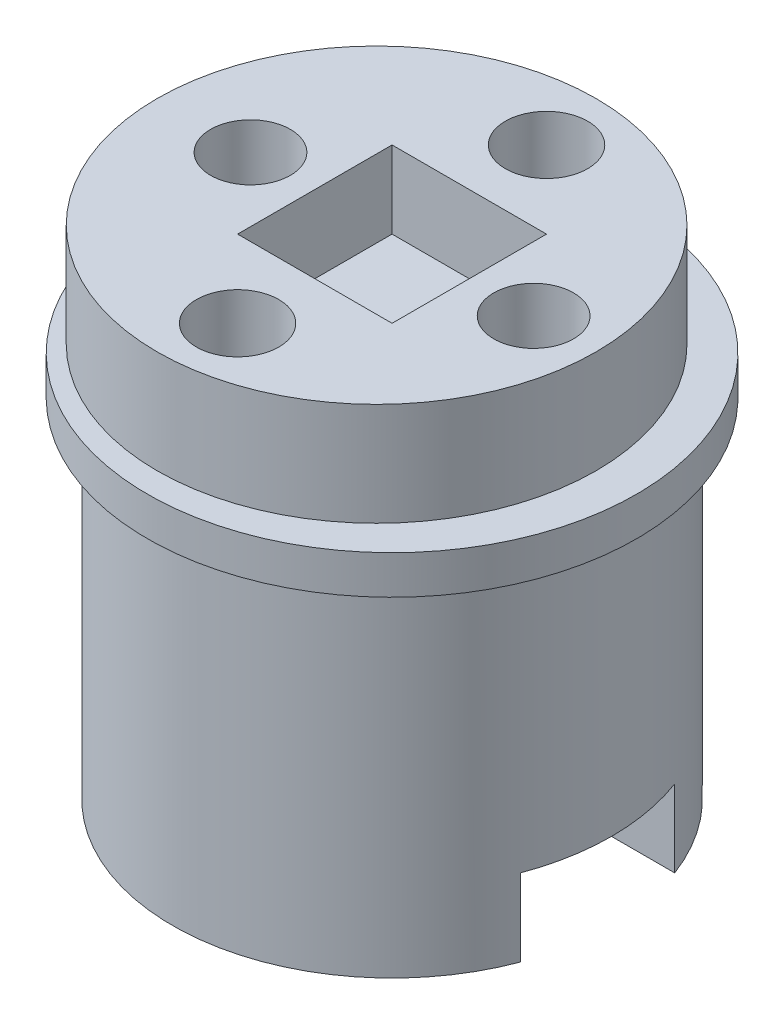
ISO-10303-21;
HEADER;
FILE_DESCRIPTION(('STEP AP214'),'2;1');
FILE_NAME('part.step','',(''),(''),'','','');
FILE_SCHEMA(('AUTOMOTIVE_DESIGN { 1 0 10303 214 1 1 1 1 }'));
ENDSEC;
DATA;
#1=APPLICATION_CONTEXT('core data for automotive mechanical design processes');
#2=APPLICATION_PROTOCOL_DEFINITION('international standard','automotive_design',2000,#1);
#3=PRODUCT_CONTEXT('',#1,'mechanical');
#4=PRODUCT('Part','Part','',(#3));
#5=PRODUCT_RELATED_PRODUCT_CATEGORY('part','',(#4));
#6=PRODUCT_DEFINITION_FORMATION('','',#4);
#7=PRODUCT_DEFINITION_CONTEXT('part definition',#1,'design');
#8=PRODUCT_DEFINITION('design','',#6,#7);
#9=PRODUCT_DEFINITION_SHAPE('','',#8);
#10=(LENGTH_UNIT() NAMED_UNIT(*) SI_UNIT(.MILLI.,.METRE.));
#11=(NAMED_UNIT(*) PLANE_ANGLE_UNIT() SI_UNIT($,.RADIAN.));
#12=(NAMED_UNIT(*) SI_UNIT($,.STERADIAN.) SOLID_ANGLE_UNIT());
#13=UNCERTAINTY_MEASURE_WITH_UNIT(LENGTH_MEASURE(1.E-05),#10,'distance_accuracy_value','');
#14=(GEOMETRIC_REPRESENTATION_CONTEXT(3) GLOBAL_UNCERTAINTY_ASSIGNED_CONTEXT((#13)) GLOBAL_UNIT_ASSIGNED_CONTEXT((#10,
#11,#12)) REPRESENTATION_CONTEXT('',''));
#15=CARTESIAN_POINT('',(0.,0.,0.));
#16=DIRECTION('',(0.,0.,1.));
#17=DIRECTION('',(1.,0.,0.));
#18=AXIS2_PLACEMENT_3D('',#15,#16,#17);
#19=CARTESIAN_POINT('',(6.1,20.6340620433566,0.));
#20=DIRECTION('',(0.,-1.,0.));
#21=DIRECTION('',(0.,0.,-1.));
#22=AXIS2_PLACEMENT_3D('',#19,#20,#21);
#23=CYLINDRICAL_SURFACE('',#22,1.55);
#24=CARTESIAN_POINT('',(6.1,-12.,0.));
#25=DIRECTION('',(0.,-1.,0.));
#26=DIRECTION('',(0.,0.,-1.));
#27=AXIS2_PLACEMENT_3D('',#24,#25,#26);
#28=CIRCLE('',#27,1.55);
#29=CARTESIAN_POINT('',(6.1,-12.,-1.55));
#30=VERTEX_POINT('',#29);
#31=EDGE_CURVE('E196',#30,#30,#28,.F.);
#32=CARTESIAN_POINT('',(6.1,4.,0.));
#33=DIRECTION('',(0.,1.,0.));
#34=DIRECTION('',(0.,0.,1.));
#35=AXIS2_PLACEMENT_3D('',#32,#33,#34);
#36=CIRCLE('',#35,1.55);
#37=CARTESIAN_POINT('',(6.1,4.,-1.55));
#38=VERTEX_POINT('',#37);
#39=EDGE_CURVE('E175',#38,#38,#36,.F.);
#40=CARTESIAN_POINT('',(6.1,-12.,-1.55));
#41=CARTESIAN_POINT('',(6.1,-11.8333333333333,-1.55));
#42=CARTESIAN_POINT('',(6.1,-11.6666666666667,-1.55));
#43=CARTESIAN_POINT('',(6.1,-11.3333333333333,-1.55));
#44=CARTESIAN_POINT('',(6.1,-11.1666666666667,-1.55));
#45=CARTESIAN_POINT('',(6.1,-10.8333333333333,-1.55));
#46=CARTESIAN_POINT('',(6.1,-10.6666666666667,-1.55));
#47=CARTESIAN_POINT('',(6.1,-10.3333333333333,-1.55));
#48=CARTESIAN_POINT('',(6.1,-10.1666666666667,-1.55));
#49=CARTESIAN_POINT('',(6.1,-9.83333333333333,-1.55));
#50=CARTESIAN_POINT('',(6.1,-9.66666666666666,-1.55));
#51=CARTESIAN_POINT('',(6.1,-9.33333333333333,-1.55));
#52=CARTESIAN_POINT('',(6.1,-9.16666666666666,-1.55));
#53=CARTESIAN_POINT('',(6.1,-8.83333333333333,-1.55));
#54=CARTESIAN_POINT('',(6.1,-8.66666666666666,-1.55));
#55=CARTESIAN_POINT('',(6.1,-8.33333333333333,-1.55));
#56=CARTESIAN_POINT('',(6.1,-8.16666666666666,-1.55));
#57=CARTESIAN_POINT('',(6.1,-7.83333333333333,-1.55));
#58=CARTESIAN_POINT('',(6.1,-7.66666666666666,-1.55));
#59=CARTESIAN_POINT('',(6.1,-7.33333333333333,-1.55));
#60=CARTESIAN_POINT('',(6.1,-7.16666666666666,-1.55));
#61=CARTESIAN_POINT('',(6.1,-6.83333333333333,-1.55));
#62=CARTESIAN_POINT('',(6.1,-6.66666666666666,-1.55));
#63=CARTESIAN_POINT('',(6.1,-6.33333333333333,-1.55));
#64=CARTESIAN_POINT('',(6.1,-6.16666666666666,-1.55));
#65=CARTESIAN_POINT('',(6.1,-5.83333333333333,-1.55));
#66=CARTESIAN_POINT('',(6.1,-5.66666666666666,-1.55));
#67=CARTESIAN_POINT('',(6.1,-5.33333333333333,-1.55));
#68=CARTESIAN_POINT('',(6.1,-5.16666666666666,-1.55));
#69=CARTESIAN_POINT('',(6.1,-4.83333333333333,-1.55));
#70=CARTESIAN_POINT('',(6.1,-4.66666666666666,-1.55));
#71=CARTESIAN_POINT('',(6.1,-4.33333333333333,-1.55));
#72=CARTESIAN_POINT('',(6.1,-4.16666666666666,-1.55));
#73=CARTESIAN_POINT('',(6.1,-3.83333333333333,-1.55));
#74=CARTESIAN_POINT('',(6.1,-3.66666666666666,-1.55));
#75=CARTESIAN_POINT('',(6.1,-3.33333333333333,-1.55));
#76=CARTESIAN_POINT('',(6.1,-3.16666666666666,-1.55));
#77=CARTESIAN_POINT('',(6.1,-2.83333333333333,-1.55));
#78=CARTESIAN_POINT('',(6.1,-2.66666666666667,-1.55));
#79=CARTESIAN_POINT('',(6.1,-2.33333333333333,-1.55));
#80=CARTESIAN_POINT('',(6.1,-2.16666666666667,-1.55));
#81=CARTESIAN_POINT('',(6.1,-1.83333333333333,-1.55));
#82=CARTESIAN_POINT('',(6.1,-1.66666666666666,-1.55));
#83=CARTESIAN_POINT('',(6.1,-1.33333333333333,-1.55));
#84=CARTESIAN_POINT('',(6.1,-1.16666666666666,-1.55));
#85=CARTESIAN_POINT('',(6.1,-0.833333333333331,-1.55));
#86=CARTESIAN_POINT('',(6.1,-0.666666666666664,-1.55));
#87=CARTESIAN_POINT('',(6.1,-0.33333333333333,-1.55));
#88=CARTESIAN_POINT('',(6.1,-0.166666666666663,-1.55));
#89=CARTESIAN_POINT('',(6.1,0.16666666666667,-1.55));
#90=CARTESIAN_POINT('',(6.1,0.333333333333337,-1.55));
#91=CARTESIAN_POINT('',(6.1,0.66666666666667,-1.55));
#92=CARTESIAN_POINT('',(6.1,0.833333333333335,-1.55));
#93=CARTESIAN_POINT('',(6.1,1.16666666666667,-1.55));
#94=CARTESIAN_POINT('',(6.1,1.33333333333333,-1.55));
#95=CARTESIAN_POINT('',(6.1,1.66666666666667,-1.55));
#96=CARTESIAN_POINT('',(6.1,1.83333333333334,-1.55));
#97=CARTESIAN_POINT('',(6.1,2.16666666666667,-1.55));
#98=CARTESIAN_POINT('',(6.1,2.33333333333333,-1.55));
#99=CARTESIAN_POINT('',(6.1,2.66666666666667,-1.55));
#100=CARTESIAN_POINT('',(6.1,2.83333333333333,-1.55));
#101=CARTESIAN_POINT('',(6.1,3.16666666666667,-1.55));
#102=CARTESIAN_POINT('',(6.1,3.33333333333333,-1.55));
#103=CARTESIAN_POINT('',(6.1,3.66666666666667,-1.55));
#104=CARTESIAN_POINT('',(6.1,3.83333333333333,-1.55));
#105=CARTESIAN_POINT('',(6.1,4.,-1.55));
#106=B_SPLINE_CURVE_WITH_KNOTS('',3,(#40,#41,#42,#43,#44,#45,#46,#47,#48,#49,#50,#51,#52,#53,
#54,#55,#56,#57,#58,#59,#60,#61,#62,#63,#64,#65,#66,#67,#68,#69,#70,#71,#72,#73,#74,#75,#76,#77,
#78,#79,#80,#81,#82,#83,#84,#85,#86,#87,#88,#89,#90,#91,#92,#93,#94,#95,#96,#97,#98,#99,#100,
#101,#102,#103,#104,#105),.UNSPECIFIED.,.F.,.F.,(4,2,2,2,2,2,2,2,2,2,2,2,2,2,2,2,2,2,2,2,2,2,2,
2,2,2,2,2,2,2,2,2,4),(0.,0.5,1.,1.49999999999999,1.99999999999999,2.5,3.,3.5,3.99999999999999,
4.49999999999999,4.99999999999999,5.49999999999999,5.99999999999999,6.5,7.,7.49999999999999,
7.99999999999999,8.49999999999999,8.99999999999999,9.49999999999999,9.99999999999999,10.5,11.,
11.5,12.,12.5,13.,13.5,14.,14.5,15.,15.5,16.),.UNSPECIFIED.);
#107=EDGE_CURVE('BSEAM38',#30,#38,#106,.T.);
#108=ORIENTED_EDGE('',*,*,#31,.F.);
#109=ORIENTED_EDGE('',*,*,#39,.F.);
#110=ORIENTED_EDGE('',*,*,#107,.T.);
#111=ORIENTED_EDGE('',*,*,#107,.F.);
#112=EDGE_LOOP('',(#108,#110,#109,#111));
#113=FACE_BOUND('',#112,.T.);
#114=ADVANCED_FACE('F38',(#113),#23,.F.);
#115=CARTESIAN_POINT('',(-4.9,20.6340620433566,0.));
#116=DIRECTION('',(0.,-1.,0.));
#117=DIRECTION('',(0.,0.,-1.));
#118=AXIS2_PLACEMENT_3D('',#115,#116,#117);
#119=CYLINDRICAL_SURFACE('',#118,1.55);
#120=CARTESIAN_POINT('',(-4.9,-12.,0.));
#121=DIRECTION('',(0.,-1.,0.));
#122=DIRECTION('',(0.,0.,-1.));
#123=AXIS2_PLACEMENT_3D('',#120,#121,#122);
#124=CIRCLE('',#123,1.55);
#125=CARTESIAN_POINT('',(-4.9,-12.,-1.55));
#126=VERTEX_POINT('',#125);
#127=EDGE_CURVE('E217',#126,#126,#124,.F.);
#128=CARTESIAN_POINT('',(-4.9,4.,0.));
#129=DIRECTION('',(0.,1.,0.));
#130=DIRECTION('',(0.,0.,1.));
#131=AXIS2_PLACEMENT_3D('',#128,#129,#130);
#132=CIRCLE('',#131,1.55);
#133=CARTESIAN_POINT('',(-4.9,4.,-1.55));
#134=VERTEX_POINT('',#133);
#135=EDGE_CURVE('E172',#134,#134,#132,.F.);
#136=CARTESIAN_POINT('',(-4.9,-12.,-1.55));
#137=CARTESIAN_POINT('',(-4.9,-11.8333333333333,-1.55));
#138=CARTESIAN_POINT('',(-4.9,-11.6666666666667,-1.55));
#139=CARTESIAN_POINT('',(-4.9,-11.3333333333333,-1.55));
#140=CARTESIAN_POINT('',(-4.9,-11.1666666666667,-1.55));
#141=CARTESIAN_POINT('',(-4.9,-10.8333333333333,-1.55));
#142=CARTESIAN_POINT('',(-4.9,-10.6666666666667,-1.55));
#143=CARTESIAN_POINT('',(-4.9,-10.3333333333333,-1.55));
#144=CARTESIAN_POINT('',(-4.9,-10.1666666666667,-1.55));
#145=CARTESIAN_POINT('',(-4.9,-9.83333333333333,-1.55));
#146=CARTESIAN_POINT('',(-4.9,-9.66666666666666,-1.55));
#147=CARTESIAN_POINT('',(-4.9,-9.33333333333333,-1.55));
#148=CARTESIAN_POINT('',(-4.9,-9.16666666666666,-1.55));
#149=CARTESIAN_POINT('',(-4.9,-8.83333333333333,-1.55));
#150=CARTESIAN_POINT('',(-4.9,-8.66666666666666,-1.55));
#151=CARTESIAN_POINT('',(-4.9,-8.33333333333333,-1.55));
#152=CARTESIAN_POINT('',(-4.9,-8.16666666666666,-1.55));
#153=CARTESIAN_POINT('',(-4.9,-7.83333333333333,-1.55));
#154=CARTESIAN_POINT('',(-4.9,-7.66666666666666,-1.55));
#155=CARTESIAN_POINT('',(-4.9,-7.33333333333333,-1.55));
#156=CARTESIAN_POINT('',(-4.9,-7.16666666666666,-1.55));
#157=CARTESIAN_POINT('',(-4.9,-6.83333333333333,-1.55));
#158=CARTESIAN_POINT('',(-4.9,-6.66666666666666,-1.55));
#159=CARTESIAN_POINT('',(-4.9,-6.33333333333333,-1.55));
#160=CARTESIAN_POINT('',(-4.9,-6.16666666666666,-1.55));
#161=CARTESIAN_POINT('',(-4.9,-5.83333333333333,-1.55));
#162=CARTESIAN_POINT('',(-4.9,-5.66666666666666,-1.55));
#163=CARTESIAN_POINT('',(-4.9,-5.33333333333333,-1.55));
#164=CARTESIAN_POINT('',(-4.9,-5.16666666666666,-1.55));
#165=CARTESIAN_POINT('',(-4.9,-4.83333333333333,-1.55));
#166=CARTESIAN_POINT('',(-4.9,-4.66666666666666,-1.55));
#167=CARTESIAN_POINT('',(-4.9,-4.33333333333333,-1.55));
#168=CARTESIAN_POINT('',(-4.9,-4.16666666666666,-1.55));
#169=CARTESIAN_POINT('',(-4.9,-3.83333333333333,-1.55));
#170=CARTESIAN_POINT('',(-4.9,-3.66666666666666,-1.55));
#171=CARTESIAN_POINT('',(-4.9,-3.33333333333333,-1.55));
#172=CARTESIAN_POINT('',(-4.9,-3.16666666666666,-1.55));
#173=CARTESIAN_POINT('',(-4.9,-2.83333333333333,-1.55));
#174=CARTESIAN_POINT('',(-4.9,-2.66666666666667,-1.55));
#175=CARTESIAN_POINT('',(-4.9,-2.33333333333333,-1.55));
#176=CARTESIAN_POINT('',(-4.9,-2.16666666666667,-1.55));
#177=CARTESIAN_POINT('',(-4.9,-1.83333333333333,-1.55));
#178=CARTESIAN_POINT('',(-4.9,-1.66666666666666,-1.55));
#179=CARTESIAN_POINT('',(-4.9,-1.33333333333333,-1.55));
#180=CARTESIAN_POINT('',(-4.9,-1.16666666666666,-1.55));
#181=CARTESIAN_POINT('',(-4.9,-0.833333333333331,-1.55));
#182=CARTESIAN_POINT('',(-4.9,-0.666666666666664,-1.55));
#183=CARTESIAN_POINT('',(-4.9,-0.33333333333333,-1.55));
#184=CARTESIAN_POINT('',(-4.9,-0.166666666666663,-1.55));
#185=CARTESIAN_POINT('',(-4.9,0.16666666666667,-1.55));
#186=CARTESIAN_POINT('',(-4.9,0.333333333333337,-1.55));
#187=CARTESIAN_POINT('',(-4.9,0.66666666666667,-1.55));
#188=CARTESIAN_POINT('',(-4.9,0.833333333333335,-1.55));
#189=CARTESIAN_POINT('',(-4.9,1.16666666666667,-1.55));
#190=CARTESIAN_POINT('',(-4.9,1.33333333333333,-1.55));
#191=CARTESIAN_POINT('',(-4.9,1.66666666666667,-1.55));
#192=CARTESIAN_POINT('',(-4.9,1.83333333333334,-1.55));
#193=CARTESIAN_POINT('',(-4.9,2.16666666666667,-1.55));
#194=CARTESIAN_POINT('',(-4.9,2.33333333333333,-1.55));
#195=CARTESIAN_POINT('',(-4.9,2.66666666666667,-1.55));
#196=CARTESIAN_POINT('',(-4.9,2.83333333333333,-1.55));
#197=CARTESIAN_POINT('',(-4.9,3.16666666666667,-1.55));
#198=CARTESIAN_POINT('',(-4.9,3.33333333333333,-1.55));
#199=CARTESIAN_POINT('',(-4.9,3.66666666666667,-1.55));
#200=CARTESIAN_POINT('',(-4.9,3.83333333333333,-1.55));
#201=CARTESIAN_POINT('',(-4.9,4.,-1.55));
#202=B_SPLINE_CURVE_WITH_KNOTS('',3,(#136,#137,#138,#139,#140,#141,#142,#143,#144,#145,#146,
#147,#148,#149,#150,#151,#152,#153,#154,#155,#156,#157,#158,#159,#160,#161,#162,#163,#164,#165,
#166,#167,#168,#169,#170,#171,#172,#173,#174,#175,#176,#177,#178,#179,#180,#181,#182,#183,#184,
#185,#186,#187,#188,#189,#190,#191,#192,#193,#194,#195,#196,#197,#198,#199,#200,#201),
.UNSPECIFIED.,.F.,.F.,(4,2,2,2,2,2,2,2,2,2,2,2,2,2,2,2,2,2,2,2,2,2,2,2,2,2,2,2,2,2,2,2,4),(0.,
0.5,1.,1.49999999999999,1.99999999999999,2.5,3.,3.5,3.99999999999999,4.49999999999999,
4.99999999999999,5.49999999999999,5.99999999999999,6.5,7.,7.49999999999999,7.99999999999999,
8.49999999999999,8.99999999999999,9.49999999999999,9.99999999999999,10.5,11.,11.5,12.,12.5,13.,
13.5,14.,14.5,15.,15.5,16.),.UNSPECIFIED.);
#203=EDGE_CURVE('BSEAM306',#126,#134,#202,.T.);
#204=ORIENTED_EDGE('',*,*,#127,.F.);
#205=ORIENTED_EDGE('',*,*,#135,.F.);
#206=ORIENTED_EDGE('',*,*,#203,.T.);
#207=ORIENTED_EDGE('',*,*,#203,.F.);
#208=EDGE_LOOP('',(#204,#206,#205,#207));
#209=FACE_BOUND('',#208,.T.);
#210=ADVANCED_FACE('F306',(#209),#119,.F.);
#211=CARTESIAN_POINT('',(0.6,20.7754833995939,6.));
#212=DIRECTION('',(0.,-1.,0.));
#213=DIRECTION('',(0.,0.,-1.));
#214=AXIS2_PLACEMENT_3D('',#211,#212,#213);
#215=CYLINDRICAL_SURFACE('',#214,1.6);
#216=CARTESIAN_POINT('',(0.6,-15.,6.));
#217=DIRECTION('',(0.,-1.,0.));
#218=DIRECTION('',(0.,0.,-1.));
#219=AXIS2_PLACEMENT_3D('',#216,#217,#218);
#220=CIRCLE('',#219,1.6);
#221=CARTESIAN_POINT('',(0.6,-15.,4.4));
#222=VERTEX_POINT('',#221);
#223=EDGE_CURVE('E223',#222,#222,#220,.T.);
#224=ORIENTED_EDGE('',*,*,#223,.T.);
#225=EDGE_LOOP('',(#224));
#226=FACE_BOUND('',#225,.T.);
#227=CARTESIAN_POINT('',(0.6,4.,6.));
#228=DIRECTION('',(0.,1.,0.));
#229=DIRECTION('',(0.,0.,1.));
#230=AXIS2_PLACEMENT_3D('',#227,#228,#229);
#231=CIRCLE('',#230,1.6);
#232=CARTESIAN_POINT('',(0.6,4.,7.6));
#233=VERTEX_POINT('',#232);
#234=EDGE_CURVE('E169',#233,#233,#231,.F.);
#235=ORIENTED_EDGE('',*,*,#234,.F.);
#236=EDGE_LOOP('',(#235));
#237=FACE_BOUND('',#236,.T.);
#238=ADVANCED_FACE('F309',(#226,#237),#215,.F.);
#239=CARTESIAN_POINT('',(0.6,20.7754833995939,-6.));
#240=DIRECTION('',(0.,-1.,0.));
#241=DIRECTION('',(0.,0.,-1.));
#242=AXIS2_PLACEMENT_3D('',#239,#240,#241);
#243=CYLINDRICAL_SURFACE('',#242,1.6);
#244=CARTESIAN_POINT('',(0.6,-15.,-6.));
#245=DIRECTION('',(0.,-1.,0.));
#246=DIRECTION('',(0.,0.,1.));
#247=AXIS2_PLACEMENT_3D('',#244,#245,#246);
#248=CIRCLE('',#247,1.6);
#249=CARTESIAN_POINT('',(0.6,-15.,-4.4));
#250=VERTEX_POINT('',#249);
#251=EDGE_CURVE('E220',#250,#250,#248,.T.);
#252=ORIENTED_EDGE('',*,*,#251,.T.);
#253=EDGE_LOOP('',(#252));
#254=FACE_BOUND('',#253,.T.);
#255=CARTESIAN_POINT('',(0.6,4.,-6.));
#256=DIRECTION('',(0.,1.,0.));
#257=DIRECTION('',(0.,0.,1.));
#258=AXIS2_PLACEMENT_3D('',#255,#256,#257);
#259=CIRCLE('',#258,1.6);
#260=CARTESIAN_POINT('',(0.6,4.,-4.4));
#261=VERTEX_POINT('',#260);
#262=EDGE_CURVE('E163',#261,#261,#259,.F.);
#263=ORIENTED_EDGE('',*,*,#262,.F.);
#264=EDGE_LOOP('',(#263));
#265=FACE_BOUND('',#264,.T.);
#266=ADVANCED_FACE('F329',(#254,#265),#243,.F.);
#267=CARTESIAN_POINT('',(0.,4.,0.));
#268=DIRECTION('',(0.,-1.,0.));
#269=DIRECTION('',(0.,0.,-1.));
#270=AXIS2_PLACEMENT_3D('',#267,#268,#269);
#271=CYLINDRICAL_SURFACE('',#270,8.525);
#272=CARTESIAN_POINT('',(0.,4.,0.));
#273=DIRECTION('',(0.,1.,0.));
#274=DIRECTION('',(0.,0.,1.));
#275=AXIS2_PLACEMENT_3D('',#272,#273,#274);
#276=CIRCLE('',#275,8.525);
#277=CARTESIAN_POINT('',(0.,4.,8.525));
#278=VERTEX_POINT('',#277);
#279=EDGE_CURVE('E243',#278,#278,#276,.T.);
#280=ORIENTED_EDGE('',*,*,#279,.F.);
#281=EDGE_LOOP('',(#280));
#282=FACE_BOUND('',#281,.T.);
#283=CARTESIAN_POINT('',(0.,0.,0.));
#284=DIRECTION('',(0.,1.,0.));
#285=DIRECTION('',(0.,0.,1.));
#286=AXIS2_PLACEMENT_3D('',#283,#284,#285);
#287=CIRCLE('',#286,8.525);
#288=CARTESIAN_POINT('',(0.,0.,8.525));
#289=VERTEX_POINT('',#288);
#290=EDGE_CURVE('E247',#289,#289,#287,.T.);
#291=ORIENTED_EDGE('',*,*,#290,.T.);
#292=EDGE_LOOP('',(#291));
#293=FACE_BOUND('',#292,.T.);
#294=ADVANCED_FACE('F40',(#282,#293),#271,.T.);
#295=CARTESIAN_POINT('',(0.,4.,0.));
#296=DIRECTION('',(0.,1.,0.));
#297=DIRECTION('',(0.,0.,1.));
#298=AXIS2_PLACEMENT_3D('',#295,#296,#297);
#299=PLANE('',#298);
#300=DIRECTION('',(0.,0.,-1.));
#301=VECTOR('',#300,1.);
#302=CARTESIAN_POINT('',(3.6,4.,-3.));
#303=LINE('',#302,#301);
#304=CARTESIAN_POINT('',(3.6,4.,3.));
#305=VERTEX_POINT('',#304);
#306=CARTESIAN_POINT('',(3.6,4.,-3.));
#307=VERTEX_POINT('',#306);
#308=EDGE_CURVE('E53',#305,#307,#303,.T.);
#309=ORIENTED_EDGE('',*,*,#308,.F.);
#310=DIRECTION('',(1.,0.,0.));
#311=VECTOR('',#310,1.);
#312=CARTESIAN_POINT('',(3.6,4.,3.));
#313=LINE('',#312,#311);
#314=CARTESIAN_POINT('',(-2.4,4.,3.));
#315=VERTEX_POINT('',#314);
#316=EDGE_CURVE('E148',#315,#305,#313,.T.);
#317=ORIENTED_EDGE('',*,*,#316,.F.);
#318=DIRECTION('',(0.,0.,1.));
#319=VECTOR('',#318,1.);
#320=CARTESIAN_POINT('',(-2.4,4.,-3.));
#321=LINE('',#320,#319);
#322=CARTESIAN_POINT('',(-2.4,4.,-3.));
#323=VERTEX_POINT('',#322);
#324=EDGE_CURVE('E151',#323,#315,#321,.T.);
#325=ORIENTED_EDGE('',*,*,#324,.F.);
#326=DIRECTION('',(-1.,0.,0.));
#327=VECTOR('',#326,1.);
#328=CARTESIAN_POINT('',(3.6,4.,-3.));
#329=LINE('',#328,#327);
#330=EDGE_CURVE('E157',#307,#323,#329,.T.);
#331=ORIENTED_EDGE('',*,*,#330,.F.);
#332=EDGE_LOOP('',(#309,#317,#325,#331));
#333=FACE_BOUND('',#332,.T.);
#334=ORIENTED_EDGE('',*,*,#279,.T.);
#335=EDGE_LOOP('',(#334));
#336=FACE_BOUND('',#335,.T.);
#337=ORIENTED_EDGE('',*,*,#262,.T.);
#338=EDGE_LOOP('',(#337));
#339=FACE_BOUND('',#338,.T.);
#340=ORIENTED_EDGE('',*,*,#234,.T.);
#341=EDGE_LOOP('',(#340));
#342=FACE_BOUND('',#341,.T.);
#343=ORIENTED_EDGE('',*,*,#135,.T.);
#344=EDGE_LOOP('',(#343));
#345=FACE_BOUND('',#344,.T.);
#346=ORIENTED_EDGE('',*,*,#39,.T.);
#347=EDGE_LOOP('',(#346));
#348=FACE_BOUND('',#347,.T.);
#349=ADVANCED_FACE('F313',(#333,#336,#339,#342,#345,#348),#299,.T.);
#350=CARTESIAN_POINT('',(0.6,0.,0.));
#351=DIRECTION('',(0.,-1.,0.));
#352=DIRECTION('',(0.,0.,-1.));
#353=AXIS2_PLACEMENT_3D('',#350,#351,#352);
#354=PLANE('',#353);
#355=ORIENTED_EDGE('',*,*,#290,.F.);
#356=EDGE_LOOP('',(#355));
#357=FACE_BOUND('',#356,.T.);
#358=CARTESIAN_POINT('',(0.6,0.,0.));
#359=DIRECTION('',(0.,-1.,0.));
#360=DIRECTION('',(0.,0.,-1.));
#361=AXIS2_PLACEMENT_3D('',#358,#359,#360);
#362=CIRCLE('',#361,9.5);
#363=CARTESIAN_POINT('',(0.6,0.,-9.5));
#364=VERTEX_POINT('',#363);
#365=EDGE_CURVE('E226',#364,#364,#362,.T.);
#366=ORIENTED_EDGE('',*,*,#365,.F.);
#367=EDGE_LOOP('',(#366));
#368=FACE_BOUND('',#367,.T.);
#369=ADVANCED_FACE('F316',(#357,#368),#354,.F.);
#370=CARTESIAN_POINT('',(0.6,-1.5,0.));
#371=DIRECTION('',(0.,1.,0.));
#372=DIRECTION('',(0.,0.,1.));
#373=AXIS2_PLACEMENT_3D('',#370,#371,#372);
#374=CYLINDRICAL_SURFACE('',#373,9.5);
#375=CARTESIAN_POINT('',(0.6,-1.5,0.));
#376=DIRECTION('',(0.,-1.,0.));
#377=DIRECTION('',(0.,0.,-1.));
#378=AXIS2_PLACEMENT_3D('',#375,#376,#377);
#379=CIRCLE('',#378,9.5);
#380=CARTESIAN_POINT('',(0.6,-1.5,-9.5));
#381=VERTEX_POINT('',#380);
#382=EDGE_CURVE('E227',#381,#381,#379,.T.);
#383=ORIENTED_EDGE('',*,*,#382,.F.);
#384=EDGE_LOOP('',(#383));
#385=FACE_BOUND('',#384,.T.);
#386=ORIENTED_EDGE('',*,*,#365,.T.);
#387=EDGE_LOOP('',(#386));
#388=FACE_BOUND('',#387,.T.);
#389=ADVANCED_FACE('F340',(#385,#388),#374,.T.);
#390=CARTESIAN_POINT('',(0.6,-1.5,0.));
#391=DIRECTION('',(0.,-1.,0.));
#392=DIRECTION('',(0.,0.,-1.));
#393=AXIS2_PLACEMENT_3D('',#390,#391,#392);
#394=PLANE('',#393);
#395=CARTESIAN_POINT('',(0.6,-1.5,0.));
#396=DIRECTION('',(0.,-1.,0.));
#397=DIRECTION('',(0.,0.,-1.));
#398=AXIS2_PLACEMENT_3D('',#395,#396,#397);
#399=CIRCLE('',#398,8.525);
#400=CARTESIAN_POINT('',(0.6,-1.5,-8.525));
#401=VERTEX_POINT('',#400);
#402=EDGE_CURVE('E230',#401,#401,#399,.T.);
#403=ORIENTED_EDGE('',*,*,#402,.F.);
#404=EDGE_LOOP('',(#403));
#405=FACE_BOUND('',#404,.T.);
#406=ORIENTED_EDGE('',*,*,#382,.T.);
#407=EDGE_LOOP('',(#406));
#408=FACE_BOUND('',#407,.T.);
#409=ADVANCED_FACE('F336',(#405,#408),#394,.T.);
#410=CARTESIAN_POINT('',(0.6,-9.2,0.));
#411=DIRECTION('',(0.,-1.,0.));
#412=DIRECTION('',(0.,0.,-1.));
#413=AXIS2_PLACEMENT_3D('',#410,#411,#412);
#414=PLANE('',#413);
#415=CARTESIAN_POINT('',(0.6,-9.2,0.));
#416=DIRECTION('',(0.,-1.,0.));
#417=DIRECTION('',(0.,0.,-1.));
#418=AXIS2_PLACEMENT_3D('',#415,#416,#417);
#419=CIRCLE('',#418,2.1);
#420=CARTESIAN_POINT('',(0.6,-9.2,-2.1));
#421=VERTEX_POINT('',#420);
#422=EDGE_CURVE('E233',#421,#421,#419,.T.);
#423=ORIENTED_EDGE('',*,*,#422,.T.);
#424=EDGE_LOOP('',(#423));
#425=FACE_BOUND('',#424,.T.);
#426=ADVANCED_FACE('F339',(#425),#414,.T.);
#427=CARTESIAN_POINT('',(0.6,-9.2,0.));
#428=DIRECTION('',(0.,-1.,0.));
#429=DIRECTION('',(0.,0.,-1.));
#430=AXIS2_PLACEMENT_3D('',#427,#428,#429);
#431=CYLINDRICAL_SURFACE('',#430,2.1);
#432=ORIENTED_EDGE('',*,*,#422,.F.);
#433=EDGE_LOOP('',(#432));
#434=FACE_BOUND('',#433,.T.);
#435=CARTESIAN_POINT('',(0.6,-15.,0.));
#436=DIRECTION('',(0.,-1.,0.));
#437=DIRECTION('',(0.,0.,-1.));
#438=AXIS2_PLACEMENT_3D('',#435,#436,#437);
#439=CIRCLE('',#438,2.1);
#440=CARTESIAN_POINT('',(0.6,-15.,-2.1));
#441=VERTEX_POINT('',#440);
#442=EDGE_CURVE('E237',#441,#441,#439,.T.);
#443=ORIENTED_EDGE('',*,*,#442,.T.);
#444=EDGE_LOOP('',(#443));
#445=FACE_BOUND('',#444,.T.);
#446=ADVANCED_FACE('F347',(#434,#445),#431,.F.);
#447=CARTESIAN_POINT('',(0.6,-15.,0.));
#448=DIRECTION('',(0.,-1.,0.));
#449=DIRECTION('',(0.,0.,-1.));
#450=AXIS2_PLACEMENT_3D('',#447,#448,#449);
#451=PLANE('',#450);
#452=DIRECTION('',(1.,0.,0.));
#453=VECTOR('',#452,1.);
#454=CARTESIAN_POINT('',(-4.9,-15.,-3.));
#455=LINE('',#454,#453);
#456=CARTESIAN_POINT('',(-7.37970080892761,-15.,-3.));
#457=VERTEX_POINT('',#456);
#458=CARTESIAN_POINT('',(-4.9,-15.,-3.));
#459=VERTEX_POINT('',#458);
#460=EDGE_CURVE('E181',#457,#459,#455,.T.);
#461=ORIENTED_EDGE('',*,*,#460,.F.);
#462=CARTESIAN_POINT('',(0.6,-15.,0.));
#463=DIRECTION('',(0.,-1.,0.));
#464=DIRECTION('',(0.,0.,-1.));
#465=AXIS2_PLACEMENT_3D('',#462,#463,#464);
#466=CIRCLE('',#465,8.525);
#467=CARTESIAN_POINT('',(8.57970080892761,-15.,-3.));
#468=VERTEX_POINT('',#467);
#469=EDGE_CURVE('E236',#457,#468,#466,.T.);
#470=ORIENTED_EDGE('',*,*,#469,.T.);
#471=DIRECTION('',(1.,0.,0.));
#472=VECTOR('',#471,1.);
#473=CARTESIAN_POINT('',(6.1,-15.,-3.));
#474=LINE('',#473,#472);
#475=CARTESIAN_POINT('',(6.1,-15.,-3.));
#476=VERTEX_POINT('',#475);
#477=EDGE_CURVE('E205',#476,#468,#474,.T.);
#478=ORIENTED_EDGE('',*,*,#477,.F.);
#479=CARTESIAN_POINT('',(6.1,-15.,0.));
#480=DIRECTION('',(0.,-1.,0.));
#481=DIRECTION('',(0.,0.,-1.));
#482=AXIS2_PLACEMENT_3D('',#479,#480,#481);
#483=CIRCLE('',#482,3.);
#484=CARTESIAN_POINT('',(6.1,-15.,3.));
#485=VERTEX_POINT('',#484);
#486=EDGE_CURVE('E190',#485,#476,#483,.T.);
#487=ORIENTED_EDGE('',*,*,#486,.F.);
#488=DIRECTION('',(-1.,0.,0.));
#489=VECTOR('',#488,1.);
#490=CARTESIAN_POINT('',(6.1,-15.,3.));
#491=LINE('',#490,#489);
#492=CARTESIAN_POINT('',(8.57970080892761,-15.,3.));
#493=VERTEX_POINT('',#492);
#494=EDGE_CURVE('E203',#493,#485,#491,.T.);
#495=ORIENTED_EDGE('',*,*,#494,.F.);
#496=CARTESIAN_POINT('',(-7.37970080892761,-15.,3.));
#497=VERTEX_POINT('',#496);
#498=EDGE_CURVE('E242',#493,#497,#466,.T.);
#499=ORIENTED_EDGE('',*,*,#498,.T.);
#500=DIRECTION('',(-1.,0.,0.));
#501=VECTOR('',#500,1.);
#502=CARTESIAN_POINT('',(-4.9,-15.,3.));
#503=LINE('',#502,#501);
#504=CARTESIAN_POINT('',(-4.9,-15.,3.));
#505=VERTEX_POINT('',#504);
#506=EDGE_CURVE('E189',#505,#497,#503,.T.);
#507=ORIENTED_EDGE('',*,*,#506,.F.);
#508=CARTESIAN_POINT('',(-4.9,-15.,0.));
#509=DIRECTION('',(0.,-1.,0.));
#510=DIRECTION('',(0.,0.,-1.));
#511=AXIS2_PLACEMENT_3D('',#508,#509,#510);
#512=CIRCLE('',#511,3.);
#513=EDGE_CURVE('E186',#459,#505,#512,.T.);
#514=ORIENTED_EDGE('',*,*,#513,.F.);
#515=EDGE_LOOP('',(#461,#470,#478,#487,#495,#499,#507,#514));
#516=FACE_BOUND('',#515,.T.);
#517=ORIENTED_EDGE('',*,*,#251,.F.);
#518=EDGE_LOOP('',(#517));
#519=FACE_BOUND('',#518,.T.);
#520=ORIENTED_EDGE('',*,*,#223,.F.);
#521=EDGE_LOOP('',(#520));
#522=FACE_BOUND('',#521,.T.);
#523=ORIENTED_EDGE('',*,*,#442,.F.);
#524=EDGE_LOOP('',(#523));
#525=FACE_BOUND('',#524,.T.);
#526=ADVANCED_FACE('F273',(#516,#519,#522,#525),#451,.T.);
#527=CARTESIAN_POINT('',(0.6,-15.,0.));
#528=DIRECTION('',(0.,1.,0.));
#529=DIRECTION('',(0.,0.,1.));
#530=AXIS2_PLACEMENT_3D('',#527,#528,#529);
#531=CYLINDRICAL_SURFACE('',#530,8.525);
#532=ORIENTED_EDGE('',*,*,#469,.F.);
#533=DIRECTION('',(0.,1.,0.));
#534=VECTOR('',#533,1.);
#535=CARTESIAN_POINT('',(-7.37970080892761,-15.,-3.));
#536=LINE('',#535,#534);
#537=CARTESIAN_POINT('',(-7.37970080892761,-12.,-3.));
#538=VERTEX_POINT('',#537);
#539=EDGE_CURVE('E11',#457,#538,#536,.T.);
#540=ORIENTED_EDGE('',*,*,#539,.T.);
#541=CARTESIAN_POINT('',(0.6,-12.,0.));
#542=DIRECTION('',(0.,-1.,0.));
#543=DIRECTION('',(0.,0.,-1.));
#544=AXIS2_PLACEMENT_3D('',#541,#542,#543);
#545=CIRCLE('',#544,8.525);
#546=CARTESIAN_POINT('',(-7.37970080892761,-12.,3.));
#547=VERTEX_POINT('',#546);
#548=EDGE_CURVE('E259',#547,#538,#545,.T.);
#549=ORIENTED_EDGE('',*,*,#548,.F.);
#550=DIRECTION('',(0.,1.,0.));
#551=VECTOR('',#550,1.);
#552=CARTESIAN_POINT('',(-7.37970080892761,-15.,3.));
#553=LINE('',#552,#551);
#554=EDGE_CURVE('E46',#547,#497,#553,.F.);
#555=ORIENTED_EDGE('',*,*,#554,.T.);
#556=ORIENTED_EDGE('',*,*,#498,.F.);
#557=DIRECTION('',(0.,1.,0.));
#558=VECTOR('',#557,1.);
#559=CARTESIAN_POINT('',(8.57970080892761,-15.,3.));
#560=LINE('',#559,#558);
#561=CARTESIAN_POINT('',(8.57970080892761,-12.,3.));
#562=VERTEX_POINT('',#561);
#563=EDGE_CURVE('E256',#493,#562,#560,.T.);
#564=ORIENTED_EDGE('',*,*,#563,.T.);
#565=CARTESIAN_POINT('',(0.6,-12.,0.));
#566=DIRECTION('',(0.,-1.,0.));
#567=DIRECTION('',(0.,0.,-1.));
#568=AXIS2_PLACEMENT_3D('',#565,#566,#567);
#569=CIRCLE('',#568,8.525);
#570=CARTESIAN_POINT('',(8.57970080892761,-12.,-3.));
#571=VERTEX_POINT('',#570);
#572=EDGE_CURVE('E246',#571,#562,#569,.T.);
#573=ORIENTED_EDGE('',*,*,#572,.F.);
#574=DIRECTION('',(0.,1.,0.));
#575=VECTOR('',#574,1.);
#576=CARTESIAN_POINT('',(8.57970080892761,-15.,-3.));
#577=LINE('',#576,#575);
#578=EDGE_CURVE('E253',#571,#468,#577,.F.);
#579=ORIENTED_EDGE('',*,*,#578,.T.);
#580=EDGE_LOOP('',(#532,#540,#549,#555,#556,#564,#573,#579));
#581=FACE_BOUND('',#580,.T.);
#582=ORIENTED_EDGE('',*,*,#402,.T.);
#583=EDGE_LOOP('',(#582));
#584=FACE_BOUND('',#583,.T.);
#585=ADVANCED_FACE('F266',(#581,#584),#531,.T.);
#586=CARTESIAN_POINT('',(6.1,-12.,3.));
#587=DIRECTION('',(0.,0.,1.));
#588=DIRECTION('',(1.,0.,0.));
#589=AXIS2_PLACEMENT_3D('',#586,#587,#588);
#590=PLANE('',#589);
#591=ORIENTED_EDGE('',*,*,#494,.T.);
#592=DIRECTION('',(0.,-1.,0.));
#593=VECTOR('',#592,1.);
#594=CARTESIAN_POINT('',(6.1,-12.,3.));
#595=LINE('',#594,#593);
#596=CARTESIAN_POINT('',(6.1,-12.,3.));
#597=VERTEX_POINT('',#596);
#598=EDGE_CURVE('E178',#597,#485,#595,.T.);
#599=ORIENTED_EDGE('',*,*,#598,.F.);
#600=DIRECTION('',(-1.,0.,0.));
#601=VECTOR('',#600,1.);
#602=CARTESIAN_POINT('',(6.1,-12.,3.));
#603=LINE('',#602,#601);
#604=EDGE_CURVE('E200',#562,#597,#603,.T.);
#605=ORIENTED_EDGE('',*,*,#604,.F.);
#606=ORIENTED_EDGE('',*,*,#563,.F.);
#607=EDGE_LOOP('',(#591,#599,#605,#606));
#608=FACE_BOUND('',#607,.T.);
#609=ADVANCED_FACE('F280',(#608),#590,.F.);
#610=CARTESIAN_POINT('',(6.1,-12.,-3.));
#611=DIRECTION('',(0.,0.,-1.));
#612=DIRECTION('',(-1.,0.,0.));
#613=AXIS2_PLACEMENT_3D('',#610,#611,#612);
#614=PLANE('',#613);
#615=DIRECTION('',(1.,0.,0.));
#616=VECTOR('',#615,1.);
#617=CARTESIAN_POINT('',(6.1,-12.,-3.));
#618=LINE('',#617,#616);
#619=CARTESIAN_POINT('',(6.1,-12.,-3.));
#620=VERTEX_POINT('',#619);
#621=EDGE_CURVE('E211',#620,#571,#618,.T.);
#622=ORIENTED_EDGE('',*,*,#621,.F.);
#623=DIRECTION('',(0.,-1.,0.));
#624=VECTOR('',#623,1.);
#625=CARTESIAN_POINT('',(6.1,-12.,-3.));
#626=LINE('',#625,#624);
#627=EDGE_CURVE('E198',#620,#476,#626,.T.);
#628=ORIENTED_EDGE('',*,*,#627,.T.);
#629=ORIENTED_EDGE('',*,*,#477,.T.);
#630=ORIENTED_EDGE('',*,*,#578,.F.);
#631=EDGE_LOOP('',(#622,#628,#629,#630));
#632=FACE_BOUND('',#631,.T.);
#633=ADVANCED_FACE('F361',(#632),#614,.F.);
#634=CARTESIAN_POINT('',(6.1,-12.,0.));
#635=DIRECTION('',(0.,-1.,0.));
#636=DIRECTION('',(0.,0.,-1.));
#637=AXIS2_PLACEMENT_3D('',#634,#635,#636);
#638=PLANE('',#637);
#639=ORIENTED_EDGE('',*,*,#572,.T.);
#640=ORIENTED_EDGE('',*,*,#604,.T.);
#641=CARTESIAN_POINT('',(6.1,-12.,0.));
#642=DIRECTION('',(0.,-1.,0.));
#643=DIRECTION('',(0.,0.,-1.));
#644=AXIS2_PLACEMENT_3D('',#641,#642,#643);
#645=CIRCLE('',#644,3.);
#646=EDGE_CURVE('E206',#597,#620,#645,.T.);
#647=ORIENTED_EDGE('',*,*,#646,.T.);
#648=ORIENTED_EDGE('',*,*,#621,.T.);
#649=EDGE_LOOP('',(#639,#640,#647,#648));
#650=FACE_BOUND('',#649,.T.);
#651=ORIENTED_EDGE('',*,*,#31,.T.);
#652=EDGE_LOOP('',(#651));
#653=FACE_BOUND('',#652,.T.);
#654=ADVANCED_FACE('F287',(#650,#653),#638,.T.);
#655=CARTESIAN_POINT('',(6.1,-12.,0.));
#656=DIRECTION('',(0.,-1.,0.));
#657=DIRECTION('',(0.,0.,-1.));
#658=AXIS2_PLACEMENT_3D('',#655,#656,#657);
#659=CYLINDRICAL_SURFACE('',#658,3.);
#660=ORIENTED_EDGE('',*,*,#486,.T.);
#661=ORIENTED_EDGE('',*,*,#627,.F.);
#662=ORIENTED_EDGE('',*,*,#646,.F.);
#663=ORIENTED_EDGE('',*,*,#598,.T.);
#664=EDGE_LOOP('',(#660,#661,#662,#663));
#665=FACE_BOUND('',#664,.T.);
#666=ADVANCED_FACE('F284',(#665),#659,.F.);
#667=CARTESIAN_POINT('',(-4.9,-12.,-3.));
#668=DIRECTION('',(0.,0.,-1.));
#669=DIRECTION('',(-1.,0.,0.));
#670=AXIS2_PLACEMENT_3D('',#667,#668,#669);
#671=PLANE('',#670);
#672=ORIENTED_EDGE('',*,*,#460,.T.);
#673=DIRECTION('',(0.,-1.,0.));
#674=VECTOR('',#673,1.);
#675=CARTESIAN_POINT('',(-4.9,-12.,-3.));
#676=LINE('',#675,#674);
#677=CARTESIAN_POINT('',(-4.9,-12.,-3.));
#678=VERTEX_POINT('',#677);
#679=EDGE_CURVE('E193',#678,#459,#676,.T.);
#680=ORIENTED_EDGE('',*,*,#679,.F.);
#681=DIRECTION('',(1.,0.,0.));
#682=VECTOR('',#681,1.);
#683=CARTESIAN_POINT('',(-4.9,-12.,-3.));
#684=LINE('',#683,#682);
#685=EDGE_CURVE('E183',#538,#678,#684,.T.);
#686=ORIENTED_EDGE('',*,*,#685,.F.);
#687=ORIENTED_EDGE('',*,*,#539,.F.);
#688=EDGE_LOOP('',(#672,#680,#686,#687));
#689=FACE_BOUND('',#688,.T.);
#690=ADVANCED_FACE('F294',(#689),#671,.F.);
#691=CARTESIAN_POINT('',(-4.9,-12.,3.));
#692=DIRECTION('',(0.,0.,1.));
#693=DIRECTION('',(1.,0.,0.));
#694=AXIS2_PLACEMENT_3D('',#691,#692,#693);
#695=PLANE('',#694);
#696=DIRECTION('',(-1.,0.,0.));
#697=VECTOR('',#696,1.);
#698=CARTESIAN_POINT('',(-4.9,-12.,3.));
#699=LINE('',#698,#697);
#700=CARTESIAN_POINT('',(-4.9,-12.,3.));
#701=VERTEX_POINT('',#700);
#702=EDGE_CURVE('E61',#701,#547,#699,.T.);
#703=ORIENTED_EDGE('',*,*,#702,.F.);
#704=DIRECTION('',(0.,-1.,0.));
#705=VECTOR('',#704,1.);
#706=CARTESIAN_POINT('',(-4.9,-12.,3.));
#707=LINE('',#706,#705);
#708=EDGE_CURVE('E185',#701,#505,#707,.T.);
#709=ORIENTED_EDGE('',*,*,#708,.T.);
#710=ORIENTED_EDGE('',*,*,#506,.T.);
#711=ORIENTED_EDGE('',*,*,#554,.F.);
#712=EDGE_LOOP('',(#703,#709,#710,#711));
#713=FACE_BOUND('',#712,.T.);
#714=ADVANCED_FACE('F302',(#713),#695,.F.);
#715=CARTESIAN_POINT('',(-4.9,-12.,0.));
#716=DIRECTION('',(0.,-1.,0.));
#717=DIRECTION('',(0.,0.,-1.));
#718=AXIS2_PLACEMENT_3D('',#715,#716,#717);
#719=PLANE('',#718);
#720=ORIENTED_EDGE('',*,*,#548,.T.);
#721=ORIENTED_EDGE('',*,*,#685,.T.);
#722=CARTESIAN_POINT('',(-4.9,-12.,0.));
#723=DIRECTION('',(0.,-1.,0.));
#724=DIRECTION('',(0.,0.,-1.));
#725=AXIS2_PLACEMENT_3D('',#722,#723,#724);
#726=CIRCLE('',#725,3.);
#727=EDGE_CURVE('E179',#678,#701,#726,.T.);
#728=ORIENTED_EDGE('',*,*,#727,.T.);
#729=ORIENTED_EDGE('',*,*,#702,.T.);
#730=EDGE_LOOP('',(#720,#721,#728,#729));
#731=FACE_BOUND('',#730,.T.);
#732=ORIENTED_EDGE('',*,*,#127,.T.);
#733=EDGE_LOOP('',(#732));
#734=FACE_BOUND('',#733,.T.);
#735=ADVANCED_FACE('F299',(#731,#734),#719,.T.);
#736=CARTESIAN_POINT('',(-4.9,-12.,0.));
#737=DIRECTION('',(0.,-1.,0.));
#738=DIRECTION('',(0.,0.,-1.));
#739=AXIS2_PLACEMENT_3D('',#736,#737,#738);
#740=CYLINDRICAL_SURFACE('',#739,3.);
#741=ORIENTED_EDGE('',*,*,#513,.T.);
#742=ORIENTED_EDGE('',*,*,#708,.F.);
#743=ORIENTED_EDGE('',*,*,#727,.F.);
#744=ORIENTED_EDGE('',*,*,#679,.T.);
#745=EDGE_LOOP('',(#741,#742,#743,#744));
#746=FACE_BOUND('',#745,.T.);
#747=ADVANCED_FACE('F298',(#746),#740,.F.);
#748=CARTESIAN_POINT('',(3.6,1.,-3.));
#749=DIRECTION('',(1.,0.,0.));
#750=DIRECTION('',(0.,0.,-1.));
#751=AXIS2_PLACEMENT_3D('',#748,#749,#750);
#752=PLANE('',#751);
#753=ORIENTED_EDGE('',*,*,#308,.T.);
#754=DIRECTION('',(0.,1.,0.));
#755=VECTOR('',#754,1.);
#756=CARTESIAN_POINT('',(3.6,1.,-3.));
#757=LINE('',#756,#755);
#758=CARTESIAN_POINT('',(3.6,1.,-3.));
#759=VERTEX_POINT('',#758);
#760=EDGE_CURVE('E126',#759,#307,#757,.T.);
#761=ORIENTED_EDGE('',*,*,#760,.F.);
#762=DIRECTION('',(0.,0.,-1.));
#763=VECTOR('',#762,1.);
#764=CARTESIAN_POINT('',(3.6,1.,-3.));
#765=LINE('',#764,#763);
#766=CARTESIAN_POINT('',(3.6,1.,3.));
#767=VERTEX_POINT('',#766);
#768=EDGE_CURVE('E130',#767,#759,#765,.T.);
#769=ORIENTED_EDGE('',*,*,#768,.F.);
#770=DIRECTION('',(0.,1.,0.));
#771=VECTOR('',#770,1.);
#772=CARTESIAN_POINT('',(3.6,1.,3.));
#773=LINE('',#772,#771);
#774=EDGE_CURVE('E161',#767,#305,#773,.T.);
#775=ORIENTED_EDGE('',*,*,#774,.T.);
#776=EDGE_LOOP('',(#753,#761,#769,#775));
#777=FACE_BOUND('',#776,.T.);
#778=ADVANCED_FACE('F128',(#777),#752,.F.);
#779=CARTESIAN_POINT('',(3.6,1.,3.));
#780=DIRECTION('',(0.,0.,1.));
#781=DIRECTION('',(1.,0.,0.));
#782=AXIS2_PLACEMENT_3D('',#779,#780,#781);
#783=PLANE('',#782);
#784=ORIENTED_EDGE('',*,*,#316,.T.);
#785=ORIENTED_EDGE('',*,*,#774,.F.);
#786=DIRECTION('',(1.,0.,0.));
#787=VECTOR('',#786,1.);
#788=CARTESIAN_POINT('',(3.6,1.,3.));
#789=LINE('',#788,#787);
#790=CARTESIAN_POINT('',(-2.4,1.,3.));
#791=VERTEX_POINT('',#790);
#792=EDGE_CURVE('E136',#791,#767,#789,.T.);
#793=ORIENTED_EDGE('',*,*,#792,.F.);
#794=DIRECTION('',(0.,1.,0.));
#795=VECTOR('',#794,1.);
#796=CARTESIAN_POINT('',(-2.4,1.,3.));
#797=LINE('',#796,#795);
#798=EDGE_CURVE('E164',#791,#315,#797,.T.);
#799=ORIENTED_EDGE('',*,*,#798,.T.);
#800=EDGE_LOOP('',(#784,#785,#793,#799));
#801=FACE_BOUND('',#800,.T.);
#802=ADVANCED_FACE('F382',(#801),#783,.F.);
#803=CARTESIAN_POINT('',(-2.4,1.,-3.));
#804=DIRECTION('',(-1.,0.,0.));
#805=DIRECTION('',(0.,0.,1.));
#806=AXIS2_PLACEMENT_3D('',#803,#804,#805);
#807=PLANE('',#806);
#808=ORIENTED_EDGE('',*,*,#324,.T.);
#809=ORIENTED_EDGE('',*,*,#798,.F.);
#810=DIRECTION('',(0.,0.,1.));
#811=VECTOR('',#810,1.);
#812=CARTESIAN_POINT('',(-2.4,1.,-3.));
#813=LINE('',#812,#811);
#814=CARTESIAN_POINT('',(-2.4,1.,-3.));
#815=VERTEX_POINT('',#814);
#816=EDGE_CURVE('E144',#815,#791,#813,.T.);
#817=ORIENTED_EDGE('',*,*,#816,.F.);
#818=DIRECTION('',(0.,1.,0.));
#819=VECTOR('',#818,1.);
#820=CARTESIAN_POINT('',(-2.4,1.,-3.));
#821=LINE('',#820,#819);
#822=EDGE_CURVE('E135',#815,#323,#821,.T.);
#823=ORIENTED_EDGE('',*,*,#822,.T.);
#824=EDGE_LOOP('',(#808,#809,#817,#823));
#825=FACE_BOUND('',#824,.T.);
#826=ADVANCED_FACE('F385',(#825),#807,.F.);
#827=CARTESIAN_POINT('',(3.6,1.,-3.));
#828=DIRECTION('',(0.,0.,-1.));
#829=DIRECTION('',(-1.,0.,0.));
#830=AXIS2_PLACEMENT_3D('',#827,#828,#829);
#831=PLANE('',#830);
#832=ORIENTED_EDGE('',*,*,#330,.T.);
#833=ORIENTED_EDGE('',*,*,#822,.F.);
#834=DIRECTION('',(-1.,0.,0.));
#835=VECTOR('',#834,1.);
#836=CARTESIAN_POINT('',(3.6,1.,-3.));
#837=LINE('',#836,#835);
#838=EDGE_CURVE('E139',#759,#815,#837,.T.);
#839=ORIENTED_EDGE('',*,*,#838,.F.);
#840=ORIENTED_EDGE('',*,*,#760,.T.);
#841=EDGE_LOOP('',(#832,#833,#839,#840));
#842=FACE_BOUND('',#841,.T.);
#843=ADVANCED_FACE('F140',(#842),#831,.F.);
#844=CARTESIAN_POINT('',(0.,1.,0.));
#845=DIRECTION('',(0.,-1.,0.));
#846=DIRECTION('',(0.,0.,-1.));
#847=AXIS2_PLACEMENT_3D('',#844,#845,#846);
#848=PLANE('',#847);
#849=ORIENTED_EDGE('',*,*,#768,.T.);
#850=ORIENTED_EDGE('',*,*,#838,.T.);
#851=ORIENTED_EDGE('',*,*,#816,.T.);
#852=ORIENTED_EDGE('',*,*,#792,.T.);
#853=EDGE_LOOP('',(#849,#850,#851,#852));
#854=FACE_BOUND('',#853,.T.);
#855=ADVANCED_FACE('F146',(#854),#848,.F.);
#856=CLOSED_SHELL('',(#114,#210,#238,#266,#294,#349,#369,#389,#409,#426,#446,#526,#585,#609,
#633,#654,#666,#690,#714,#735,#747,#778,#802,#826,#843,#855));
#857=MANIFOLD_SOLID_BREP('B2',#856);
#858=ADVANCED_BREP_SHAPE_REPRESENTATION('',(#18,#857),#14);
#859=SHAPE_DEFINITION_REPRESENTATION(#9,#858);
ENDSEC;
END-ISO-10303-21;
